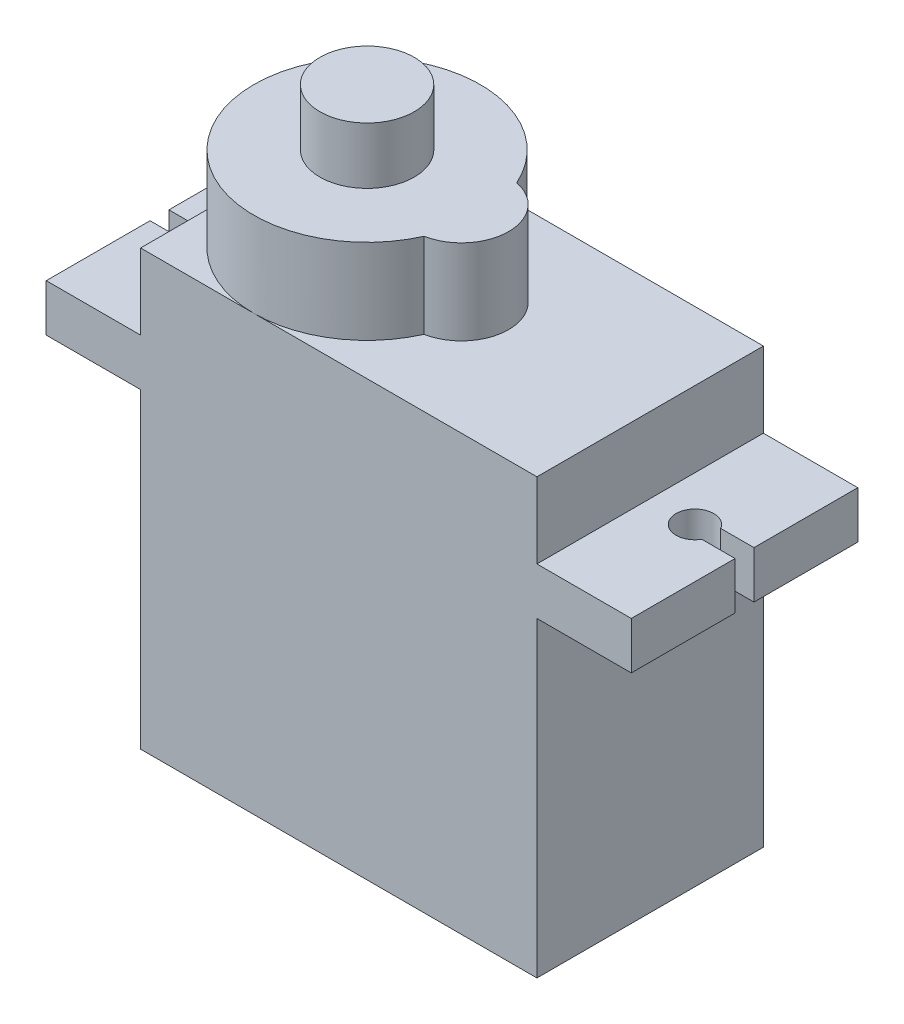
ISO-10303-21;
HEADER;
FILE_DESCRIPTION(('STEP AP214'),'2;1');
FILE_NAME('part.step','',(''),(''),'','','');
FILE_SCHEMA(('AUTOMOTIVE_DESIGN { 1 0 10303 214 1 1 1 1 }'));
ENDSEC;
DATA;
#1=APPLICATION_CONTEXT('core data for automotive mechanical design processes');
#2=APPLICATION_PROTOCOL_DEFINITION('international standard','automotive_design',2000,#1);
#3=PRODUCT_CONTEXT('',#1,'mechanical');
#4=PRODUCT('Part','Part','',(#3));
#5=PRODUCT_RELATED_PRODUCT_CATEGORY('part','',(#4));
#6=PRODUCT_DEFINITION_FORMATION('','',#4);
#7=PRODUCT_DEFINITION_CONTEXT('part definition',#1,'design');
#8=PRODUCT_DEFINITION('design','',#6,#7);
#9=PRODUCT_DEFINITION_SHAPE('','',#8);
#10=(LENGTH_UNIT() NAMED_UNIT(*) SI_UNIT(.MILLI.,.METRE.));
#11=(NAMED_UNIT(*) PLANE_ANGLE_UNIT() SI_UNIT($,.RADIAN.));
#12=(NAMED_UNIT(*) SI_UNIT($,.STERADIAN.) SOLID_ANGLE_UNIT());
#13=UNCERTAINTY_MEASURE_WITH_UNIT(LENGTH_MEASURE(1.E-05),#10,'distance_accuracy_value','');
#14=(GEOMETRIC_REPRESENTATION_CONTEXT(3) GLOBAL_UNCERTAINTY_ASSIGNED_CONTEXT((#13)) GLOBAL_UNIT_ASSIGNED_CONTEXT((#10,
#11,#12)) REPRESENTATION_CONTEXT('',''));
#15=CARTESIAN_POINT('',(0.,0.,0.));
#16=DIRECTION('',(0.,0.,1.));
#17=DIRECTION('',(1.,0.,0.));
#18=AXIS2_PLACEMENT_3D('',#15,#16,#17);
#19=CARTESIAN_POINT('',(0.,23.,0.));
#20=DIRECTION('',(0.,-1.,0.));
#21=DIRECTION('',(0.,0.,-1.));
#22=AXIS2_PLACEMENT_3D('',#19,#20,#21);
#23=PLANE('',#22);
#24=CARTESIAN_POINT('',(0.5,23.,0.));
#25=DIRECTION('',(0.,1.,0.));
#26=DIRECTION('',(0.,0.,1.));
#27=AXIS2_PLACEMENT_3D('',#24,#25,#26);
#28=CIRCLE('',#27,2.5);
#29=CARTESIAN_POINT('',(0.975000000000003,23.,2.45446022579303));
#30=VERTEX_POINT('',#29);
#31=CARTESIAN_POINT('',(0.975000000000002,23.,-2.45446022579303));
#32=VERTEX_POINT('',#31);
#33=EDGE_CURVE('E222',#30,#32,#28,.T.);
#34=ORIENTED_EDGE('',*,*,#33,.F.);
#35=CARTESIAN_POINT('',(-4.5,23.,0.));
#36=DIRECTION('',(0.,1.,0.));
#37=DIRECTION('',(0.,0.,1.));
#38=AXIS2_PLACEMENT_3D('',#35,#36,#37);
#39=CIRCLE('',#38,6.);
#40=CARTESIAN_POINT('',(-4.5,23.,6.));
#41=VERTEX_POINT('',#40);
#42=EDGE_CURVE('E70',#41,#30,#39,.T.);
#43=ORIENTED_EDGE('',*,*,#42,.F.);
#44=DIRECTION('',(1.,0.,0.));
#45=VECTOR('',#44,1.);
#46=CARTESIAN_POINT('',(-10.5,23.,6.));
#47=LINE('',#46,#45);
#48=CARTESIAN_POINT('',(10.5,23.,6.));
#49=VERTEX_POINT('',#48);
#50=EDGE_CURVE('E339',#41,#49,#47,.T.);
#51=ORIENTED_EDGE('',*,*,#50,.T.);
#52=DIRECTION('',(0.,0.,-1.));
#53=VECTOR('',#52,1.);
#54=CARTESIAN_POINT('',(10.5,23.,6.));
#55=LINE('',#54,#53);
#56=CARTESIAN_POINT('',(10.5,23.,-6.));
#57=VERTEX_POINT('',#56);
#58=EDGE_CURVE('E328',#49,#57,#55,.T.);
#59=ORIENTED_EDGE('',*,*,#58,.T.);
#60=DIRECTION('',(-1.,0.,0.));
#61=VECTOR('',#60,1.);
#62=CARTESIAN_POINT('',(-10.5,23.,-6.));
#63=LINE('',#62,#61);
#64=CARTESIAN_POINT('',(-4.5,23.,-6.));
#65=VERTEX_POINT('',#64);
#66=EDGE_CURVE('E333',#57,#65,#63,.T.);
#67=ORIENTED_EDGE('',*,*,#66,.T.);
#68=EDGE_CURVE('E64',#32,#65,#39,.T.);
#69=ORIENTED_EDGE('',*,*,#68,.F.);
#70=EDGE_LOOP('',(#34,#43,#51,#59,#67,#69));
#71=FACE_BOUND('',#70,.T.);
#72=ADVANCED_FACE('F47',(#71),#23,.F.);
#73=CARTESIAN_POINT('',(-10.5,23.,0.));
#74=VERTEX_POINT('',#73);
#75=EDGE_CURVE('E56',#65,#74,#39,.T.);
#76=ORIENTED_EDGE('',*,*,#75,.F.);
#77=CARTESIAN_POINT('',(-10.5,23.,-6.));
#78=VERTEX_POINT('',#77);
#79=EDGE_CURVE('E331',#65,#78,#63,.T.);
#80=ORIENTED_EDGE('',*,*,#79,.T.);
#81=DIRECTION('',(0.,0.,1.));
#82=VECTOR('',#81,1.);
#83=CARTESIAN_POINT('',(-10.5,23.,6.));
#84=LINE('',#83,#82);
#85=EDGE_CURVE('E336',#78,#74,#84,.T.);
#86=ORIENTED_EDGE('',*,*,#85,.T.);
#87=EDGE_LOOP('',(#76,#80,#86));
#88=FACE_BOUND('',#87,.T.);
#89=ADVANCED_FACE('F388',(#88),#23,.F.);
#90=CARTESIAN_POINT('',(-10.5,16.5,-11.5901699437495));
#91=DIRECTION('',(0.,-1.,0.));
#92=DIRECTION('',(1.,0.,0.));
#93=AXIS2_PLACEMENT_3D('',#90,#91,#92);
#94=PLANE('',#93);
#95=DIRECTION('',(0.,0.,1.));
#96=VECTOR('',#95,1.);
#97=CARTESIAN_POINT('',(-15.5,16.5,-11.5901699437495));
#98=LINE('',#97,#96);
#99=CARTESIAN_POINT('',(-15.5,16.5,0.5));
#100=VERTEX_POINT('',#99);
#101=CARTESIAN_POINT('',(-15.5,16.5,6.));
#102=VERTEX_POINT('',#101);
#103=EDGE_CURVE('E312',#100,#102,#98,.T.);
#104=ORIENTED_EDGE('',*,*,#103,.F.);
#105=DIRECTION('',(1.,0.,0.));
#106=VECTOR('',#105,1.);
#107=CARTESIAN_POINT('',(-10.5,16.5,0.5));
#108=LINE('',#107,#106);
#109=CARTESIAN_POINT('',(-13.7373598715682,16.5,0.5));
#110=VERTEX_POINT('',#109);
#111=EDGE_CURVE('E301',#100,#110,#108,.T.);
#112=ORIENTED_EDGE('',*,*,#111,.T.);
#113=CARTESIAN_POINT('',(-12.8713344677838,16.5,0.));
#114=DIRECTION('',(0.,-1.,0.));
#115=DIRECTION('',(1.,0.,0.));
#116=AXIS2_PLACEMENT_3D('',#113,#114,#115);
#117=CIRCLE('',#116,1.);
#118=CARTESIAN_POINT('',(-13.7373598715682,16.5,-0.5));
#119=VERTEX_POINT('',#118);
#120=EDGE_CURVE('E256',#119,#110,#117,.T.);
#121=ORIENTED_EDGE('',*,*,#120,.F.);
#122=DIRECTION('',(-1.,0.,0.));
#123=VECTOR('',#122,1.);
#124=CARTESIAN_POINT('',(-10.5,16.5,-0.5));
#125=LINE('',#124,#123);
#126=CARTESIAN_POINT('',(-15.5,16.5,-0.5));
#127=VERTEX_POINT('',#126);
#128=EDGE_CURVE('E915',#119,#127,#125,.T.);
#129=ORIENTED_EDGE('',*,*,#128,.T.);
#130=CARTESIAN_POINT('',(-15.5,16.5,-6.));
#131=VERTEX_POINT('',#130);
#132=EDGE_CURVE('E309',#131,#127,#98,.T.);
#133=ORIENTED_EDGE('',*,*,#132,.F.);
#134=DIRECTION('',(-1.,0.,0.));
#135=VECTOR('',#134,1.);
#136=CARTESIAN_POINT('',(-10.5,16.5,-6.));
#137=LINE('',#136,#135);
#138=CARTESIAN_POINT('',(-10.5,16.5,-6.));
#139=VERTEX_POINT('',#138);
#140=EDGE_CURVE('E300',#139,#131,#137,.T.);
#141=ORIENTED_EDGE('',*,*,#140,.F.);
#142=DIRECTION('',(0.,0.,1.));
#143=VECTOR('',#142,1.);
#144=CARTESIAN_POINT('',(-10.5,16.5,-11.5901699437495));
#145=LINE('',#144,#143);
#146=CARTESIAN_POINT('',(-10.5,16.5,6.));
#147=VERTEX_POINT('',#146);
#148=EDGE_CURVE('E313',#139,#147,#145,.T.);
#149=ORIENTED_EDGE('',*,*,#148,.T.);
#150=DIRECTION('',(1.,0.,0.));
#151=VECTOR('',#150,1.);
#152=CARTESIAN_POINT('',(-10.5,16.5,6.));
#153=LINE('',#152,#151);
#154=EDGE_CURVE('E304',#102,#147,#153,.T.);
#155=ORIENTED_EDGE('',*,*,#154,.F.);
#156=EDGE_LOOP('',(#104,#112,#121,#129,#133,#141,#149,#155));
#157=FACE_BOUND('',#156,.T.);
#158=ADVANCED_FACE('F449',(#157),#94,.T.);
#159=CARTESIAN_POINT('',(-15.5,19.,-11.5901699437495));
#160=DIRECTION('',(-1.,0.,0.));
#161=DIRECTION('',(0.,0.,1.));
#162=AXIS2_PLACEMENT_3D('',#159,#160,#161);
#163=PLANE('',#162);
#164=DIRECTION('',(0.,0.,1.));
#165=VECTOR('',#164,1.);
#166=CARTESIAN_POINT('',(-15.5,19.,-11.5901699437495));
#167=LINE('',#166,#165);
#168=CARTESIAN_POINT('',(-15.5,19.,0.5));
#169=VERTEX_POINT('',#168);
#170=CARTESIAN_POINT('',(-15.5,19.,6.));
#171=VERTEX_POINT('',#170);
#172=EDGE_CURVE('E308',#169,#171,#167,.T.);
#173=ORIENTED_EDGE('',*,*,#172,.F.);
#174=DIRECTION('',(0.,-1.,0.));
#175=VECTOR('',#174,1.);
#176=CARTESIAN_POINT('',(-15.5,23.000012,0.5));
#177=LINE('',#176,#175);
#178=EDGE_CURVE('E223',#169,#100,#177,.T.);
#179=ORIENTED_EDGE('',*,*,#178,.T.);
#180=ORIENTED_EDGE('',*,*,#103,.T.);
#181=DIRECTION('',(0.,-1.,0.));
#182=VECTOR('',#181,1.);
#183=CARTESIAN_POINT('',(-15.5,19.,6.));
#184=LINE('',#183,#182);
#185=EDGE_CURVE('E319',#171,#102,#184,.T.);
#186=ORIENTED_EDGE('',*,*,#185,.F.);
#187=EDGE_LOOP('',(#173,#179,#180,#186));
#188=FACE_BOUND('',#187,.T.);
#189=ADVANCED_FACE('F468',(#188),#163,.T.);
#190=ORIENTED_EDGE('',*,*,#132,.T.);
#191=DIRECTION('',(0.,-1.,0.));
#192=VECTOR('',#191,1.);
#193=CARTESIAN_POINT('',(-15.5,23.000012,-0.5));
#194=LINE('',#193,#192);
#195=CARTESIAN_POINT('',(-15.5,19.,-0.5));
#196=VERTEX_POINT('',#195);
#197=EDGE_CURVE('E226',#196,#127,#194,.T.);
#198=ORIENTED_EDGE('',*,*,#197,.F.);
#199=CARTESIAN_POINT('',(-15.5,19.,-6.));
#200=VERTEX_POINT('',#199);
#201=EDGE_CURVE('E305',#200,#196,#167,.T.);
#202=ORIENTED_EDGE('',*,*,#201,.F.);
#203=DIRECTION('',(0.,1.,0.));
#204=VECTOR('',#203,1.);
#205=CARTESIAN_POINT('',(-15.5,19.,-6.));
#206=LINE('',#205,#204);
#207=EDGE_CURVE('E316',#131,#200,#206,.T.);
#208=ORIENTED_EDGE('',*,*,#207,.F.);
#209=EDGE_LOOP('',(#190,#198,#202,#208));
#210=FACE_BOUND('',#209,.T.);
#211=ADVANCED_FACE('F504',(#210),#163,.T.);
#212=CARTESIAN_POINT('',(-10.5,19.,-11.5901699437495));
#213=DIRECTION('',(0.,1.,0.));
#214=DIRECTION('',(-1.,0.,0.));
#215=AXIS2_PLACEMENT_3D('',#212,#213,#214);
#216=PLANE('',#215);
#217=CARTESIAN_POINT('',(-12.8713344677838,19.,0.));
#218=DIRECTION('',(0.,1.,0.));
#219=DIRECTION('',(-1.,0.,0.));
#220=AXIS2_PLACEMENT_3D('',#217,#218,#219);
#221=CIRCLE('',#220,1.);
#222=CARTESIAN_POINT('',(-13.7373598715682,19.,0.5));
#223=VERTEX_POINT('',#222);
#224=CARTESIAN_POINT('',(-13.7373598715682,19.,-0.5));
#225=VERTEX_POINT('',#224);
#226=EDGE_CURVE('E373',#223,#225,#221,.T.);
#227=ORIENTED_EDGE('',*,*,#226,.F.);
#228=DIRECTION('',(-1.,0.,0.));
#229=VECTOR('',#228,1.);
#230=CARTESIAN_POINT('',(-10.5,19.,0.5));
#231=LINE('',#230,#229);
#232=EDGE_CURVE('E51',#223,#169,#231,.T.);
#233=ORIENTED_EDGE('',*,*,#232,.T.);
#234=ORIENTED_EDGE('',*,*,#172,.T.);
#235=DIRECTION('',(-1.,0.,0.));
#236=VECTOR('',#235,1.);
#237=CARTESIAN_POINT('',(-10.5,19.,6.));
#238=LINE('',#237,#236);
#239=CARTESIAN_POINT('',(-10.5,19.,6.));
#240=VERTEX_POINT('',#239);
#241=EDGE_CURVE('E322',#240,#171,#238,.T.);
#242=ORIENTED_EDGE('',*,*,#241,.F.);
#243=DIRECTION('',(0.,0.,1.));
#244=VECTOR('',#243,1.);
#245=CARTESIAN_POINT('',(-10.5,19.,-11.5901699437495));
#246=LINE('',#245,#244);
#247=CARTESIAN_POINT('',(-10.5,19.,-6.));
#248=VERTEX_POINT('',#247);
#249=EDGE_CURVE('E302',#248,#240,#246,.T.);
#250=ORIENTED_EDGE('',*,*,#249,.F.);
#251=DIRECTION('',(1.,0.,0.));
#252=VECTOR('',#251,1.);
#253=CARTESIAN_POINT('',(-10.5,19.,-6.));
#254=LINE('',#253,#252);
#255=EDGE_CURVE('E297',#200,#248,#254,.T.);
#256=ORIENTED_EDGE('',*,*,#255,.F.);
#257=ORIENTED_EDGE('',*,*,#201,.T.);
#258=DIRECTION('',(1.,0.,0.));
#259=VECTOR('',#258,1.);
#260=CARTESIAN_POINT('',(-10.5,19.,-0.5));
#261=LINE('',#260,#259);
#262=EDGE_CURVE('E374',#196,#225,#261,.T.);
#263=ORIENTED_EDGE('',*,*,#262,.T.);
#264=EDGE_LOOP('',(#227,#233,#234,#242,#250,#256,#257,#263));
#265=FACE_BOUND('',#264,.T.);
#266=ADVANCED_FACE('F464',(#265),#216,.T.);
#267=CARTESIAN_POINT('',(10.5,19.,-11.5901699437495));
#268=DIRECTION('',(0.,1.,0.));
#269=DIRECTION('',(0.,0.,1.));
#270=AXIS2_PLACEMENT_3D('',#267,#268,#269);
#271=PLANE('',#270);
#272=CARTESIAN_POINT('',(12.8713344677838,19.,0.));
#273=DIRECTION('',(0.,1.,0.));
#274=DIRECTION('',(0.,0.,1.));
#275=AXIS2_PLACEMENT_3D('',#272,#273,#274);
#276=CIRCLE('',#275,1.);
#277=CARTESIAN_POINT('',(13.7373598715682,19.,-0.499999999999984));
#278=VERTEX_POINT('',#277);
#279=CARTESIAN_POINT('',(13.7373598715682,19.,0.500000000000016));
#280=VERTEX_POINT('',#279);
#281=EDGE_CURVE('E247',#278,#280,#276,.T.);
#282=ORIENTED_EDGE('',*,*,#281,.F.);
#283=DIRECTION('',(1.,0.,0.));
#284=VECTOR('',#283,1.);
#285=CARTESIAN_POINT('',(10.5,19.,-0.499999999999988));
#286=LINE('',#285,#284);
#287=CARTESIAN_POINT('',(15.5,19.,-0.499999999999983));
#288=VERTEX_POINT('',#287);
#289=EDGE_CURVE('E253',#278,#288,#286,.T.);
#290=ORIENTED_EDGE('',*,*,#289,.T.);
#291=DIRECTION('',(0.,0.,1.));
#292=VECTOR('',#291,1.);
#293=CARTESIAN_POINT('',(15.5,19.,-11.5901699437495));
#294=LINE('',#293,#292);
#295=CARTESIAN_POINT('',(15.5,19.,-6.));
#296=VERTEX_POINT('',#295);
#297=EDGE_CURVE('E275',#296,#288,#294,.T.);
#298=ORIENTED_EDGE('',*,*,#297,.F.);
#299=DIRECTION('',(1.,0.,0.));
#300=VECTOR('',#299,1.);
#301=CARTESIAN_POINT('',(10.5,19.,-6.));
#302=LINE('',#301,#300);
#303=CARTESIAN_POINT('',(10.5,19.,-6.));
#304=VERTEX_POINT('',#303);
#305=EDGE_CURVE('E296',#304,#296,#302,.T.);
#306=ORIENTED_EDGE('',*,*,#305,.F.);
#307=DIRECTION('',(0.,0.,1.));
#308=VECTOR('',#307,1.);
#309=CARTESIAN_POINT('',(10.5,19.,-11.5901699437495));
#310=LINE('',#309,#308);
#311=CARTESIAN_POINT('',(10.5,19.,6.));
#312=VERTEX_POINT('',#311);
#313=EDGE_CURVE('E399',#304,#312,#310,.T.);
#314=ORIENTED_EDGE('',*,*,#313,.T.);
#315=DIRECTION('',(-1.,0.,0.));
#316=VECTOR('',#315,1.);
#317=CARTESIAN_POINT('',(10.5,19.,6.));
#318=LINE('',#317,#316);
#319=CARTESIAN_POINT('',(15.5,19.,6.));
#320=VERTEX_POINT('',#319);
#321=EDGE_CURVE('E293',#320,#312,#318,.T.);
#322=ORIENTED_EDGE('',*,*,#321,.F.);
#323=CARTESIAN_POINT('',(15.5,19.,0.500000000000017));
#324=VERTEX_POINT('',#323);
#325=EDGE_CURVE('E285',#324,#320,#294,.T.);
#326=ORIENTED_EDGE('',*,*,#325,.F.);
#327=DIRECTION('',(-1.,0.,0.));
#328=VECTOR('',#327,1.);
#329=CARTESIAN_POINT('',(10.5,19.,0.500000000000013));
#330=LINE('',#329,#328);
#331=EDGE_CURVE('E249',#324,#280,#330,.T.);
#332=ORIENTED_EDGE('',*,*,#331,.T.);
#333=EDGE_LOOP('',(#282,#290,#298,#306,#314,#322,#326,#332));
#334=FACE_BOUND('',#333,.T.);
#335=ADVANCED_FACE('F403',(#334),#271,.T.);
#336=CARTESIAN_POINT('',(15.5,19.,-11.5901699437495));
#337=DIRECTION('',(1.,0.,0.));
#338=DIRECTION('',(0.,1.,0.));
#339=AXIS2_PLACEMENT_3D('',#336,#337,#338);
#340=PLANE('',#339);
#341=ORIENTED_EDGE('',*,*,#297,.T.);
#342=DIRECTION('',(0.,-1.,0.));
#343=VECTOR('',#342,1.);
#344=CARTESIAN_POINT('',(15.5,23.000012,-0.499999999999983));
#345=LINE('',#344,#343);
#346=CARTESIAN_POINT('',(15.5,16.5,-0.499999999999983));
#347=VERTEX_POINT('',#346);
#348=EDGE_CURVE('E246',#288,#347,#345,.T.);
#349=ORIENTED_EDGE('',*,*,#348,.T.);
#350=DIRECTION('',(0.,0.,1.));
#351=VECTOR('',#350,1.);
#352=CARTESIAN_POINT('',(15.5,16.5,-11.5901699437495));
#353=LINE('',#352,#351);
#354=CARTESIAN_POINT('',(15.5,16.5,-6.));
#355=VERTEX_POINT('',#354);
#356=EDGE_CURVE('E272',#355,#347,#353,.T.);
#357=ORIENTED_EDGE('',*,*,#356,.F.);
#358=DIRECTION('',(0.,-1.,0.));
#359=VECTOR('',#358,1.);
#360=CARTESIAN_POINT('',(15.5,19.,-6.));
#361=LINE('',#360,#359);
#362=EDGE_CURVE('E406',#296,#355,#361,.T.);
#363=ORIENTED_EDGE('',*,*,#362,.F.);
#364=EDGE_LOOP('',(#341,#349,#357,#363));
#365=FACE_BOUND('',#364,.T.);
#366=ADVANCED_FACE('F270',(#365),#340,.T.);
#367=CARTESIAN_POINT('',(15.5,16.5,0.500000000000017));
#368=VERTEX_POINT('',#367);
#369=CARTESIAN_POINT('',(15.5,16.5,6.));
#370=VERTEX_POINT('',#369);
#371=EDGE_CURVE('E286',#368,#370,#353,.T.);
#372=ORIENTED_EDGE('',*,*,#371,.F.);
#373=DIRECTION('',(0.,-1.,0.));
#374=VECTOR('',#373,1.);
#375=CARTESIAN_POINT('',(15.5,23.000012,0.500000000000017));
#376=LINE('',#375,#374);
#377=EDGE_CURVE('E250',#324,#368,#376,.T.);
#378=ORIENTED_EDGE('',*,*,#377,.F.);
#379=ORIENTED_EDGE('',*,*,#325,.T.);
#380=DIRECTION('',(0.,1.,0.));
#381=VECTOR('',#380,1.);
#382=CARTESIAN_POINT('',(15.5,19.,6.));
#383=LINE('',#382,#381);
#384=EDGE_CURVE('E413',#370,#320,#383,.T.);
#385=ORIENTED_EDGE('',*,*,#384,.F.);
#386=EDGE_LOOP('',(#372,#378,#379,#385));
#387=FACE_BOUND('',#386,.T.);
#388=ADVANCED_FACE('F423',(#387),#340,.T.);
#389=CARTESIAN_POINT('',(10.5,16.5,-11.5901699437495));
#390=DIRECTION('',(0.,-1.,0.));
#391=DIRECTION('',(0.,0.,-1.));
#392=AXIS2_PLACEMENT_3D('',#389,#390,#391);
#393=PLANE('',#392);
#394=ORIENTED_EDGE('',*,*,#356,.T.);
#395=DIRECTION('',(-1.,0.,0.));
#396=VECTOR('',#395,1.);
#397=CARTESIAN_POINT('',(10.5,16.5,-0.499999999999988));
#398=LINE('',#397,#396);
#399=CARTESIAN_POINT('',(13.7373598715682,16.5,-0.499999999999984));
#400=VERTEX_POINT('',#399);
#401=EDGE_CURVE('E281',#347,#400,#398,.T.);
#402=ORIENTED_EDGE('',*,*,#401,.T.);
#403=CARTESIAN_POINT('',(12.8713344677838,16.5,0.));
#404=DIRECTION('',(0.,-1.,0.));
#405=DIRECTION('',(0.,0.,-1.));
#406=AXIS2_PLACEMENT_3D('',#403,#404,#405);
#407=CIRCLE('',#406,1.);
#408=CARTESIAN_POINT('',(13.7373598715682,16.5,0.500000000000016));
#409=VERTEX_POINT('',#408);
#410=EDGE_CURVE('E367',#409,#400,#407,.T.);
#411=ORIENTED_EDGE('',*,*,#410,.F.);
#412=DIRECTION('',(1.,0.,0.));
#413=VECTOR('',#412,1.);
#414=CARTESIAN_POINT('',(10.5,16.5,0.500000000000013));
#415=LINE('',#414,#413);
#416=EDGE_CURVE('E369',#409,#368,#415,.T.);
#417=ORIENTED_EDGE('',*,*,#416,.T.);
#418=ORIENTED_EDGE('',*,*,#371,.T.);
#419=DIRECTION('',(1.,0.,0.));
#420=VECTOR('',#419,1.);
#421=CARTESIAN_POINT('',(10.5,16.5,6.));
#422=LINE('',#421,#420);
#423=CARTESIAN_POINT('',(10.5,16.5,6.));
#424=VERTEX_POINT('',#423);
#425=EDGE_CURVE('E325',#424,#370,#422,.T.);
#426=ORIENTED_EDGE('',*,*,#425,.F.);
#427=DIRECTION('',(0.,0.,1.));
#428=VECTOR('',#427,1.);
#429=CARTESIAN_POINT('',(10.5,16.5,-11.5901699437495));
#430=LINE('',#429,#428);
#431=CARTESIAN_POINT('',(10.5,16.5,-6.));
#432=VERTEX_POINT('',#431);
#433=EDGE_CURVE('E289',#432,#424,#430,.T.);
#434=ORIENTED_EDGE('',*,*,#433,.F.);
#435=DIRECTION('',(-1.,0.,0.));
#436=VECTOR('',#435,1.);
#437=CARTESIAN_POINT('',(10.5,16.5,-6.));
#438=LINE('',#437,#436);
#439=EDGE_CURVE('E284',#355,#432,#438,.T.);
#440=ORIENTED_EDGE('',*,*,#439,.F.);
#441=EDGE_LOOP('',(#394,#402,#411,#417,#418,#426,#434,#440));
#442=FACE_BOUND('',#441,.T.);
#443=ADVANCED_FACE('F279',(#442),#393,.T.);
#444=CARTESIAN_POINT('',(10.5,23.,6.));
#445=DIRECTION('',(-1.,0.,0.));
#446=DIRECTION('',(0.,0.,1.));
#447=AXIS2_PLACEMENT_3D('',#444,#445,#446);
#448=PLANE('',#447);
#449=ORIENTED_EDGE('',*,*,#313,.F.);
#450=DIRECTION('',(0.,-1.,0.));
#451=VECTOR('',#450,1.);
#452=CARTESIAN_POINT('',(10.5,23.,-6.));
#453=LINE('',#452,#451);
#454=EDGE_CURVE('E364',#57,#304,#453,.T.);
#455=ORIENTED_EDGE('',*,*,#454,.F.);
#456=ORIENTED_EDGE('',*,*,#58,.F.);
#457=DIRECTION('',(0.,-1.,0.));
#458=VECTOR('',#457,1.);
#459=CARTESIAN_POINT('',(10.5,23.,6.));
#460=LINE('',#459,#458);
#461=EDGE_CURVE('E354',#49,#312,#460,.T.);
#462=ORIENTED_EDGE('',*,*,#461,.T.);
#463=EDGE_LOOP('',(#449,#455,#456,#462));
#464=FACE_BOUND('',#463,.T.);
#465=ADVANCED_FACE('F397',(#464),#448,.F.);
#466=CARTESIAN_POINT('',(-10.5,23.,6.));
#467=DIRECTION('',(1.,0.,0.));
#468=DIRECTION('',(0.,0.,-1.));
#469=AXIS2_PLACEMENT_3D('',#466,#467,#468);
#470=PLANE('',#469);
#471=ORIENTED_EDGE('',*,*,#148,.F.);
#472=DIRECTION('',(0.,-1.,0.));
#473=VECTOR('',#472,1.);
#474=CARTESIAN_POINT('',(-10.5,23.,-6.));
#475=LINE('',#474,#473);
#476=CARTESIAN_POINT('',(-10.5,0.,-6.));
#477=VERTEX_POINT('',#476);
#478=EDGE_CURVE('E360',#139,#477,#475,.T.);
#479=ORIENTED_EDGE('',*,*,#478,.T.);
#480=DIRECTION('',(0.,0.,1.));
#481=VECTOR('',#480,1.);
#482=CARTESIAN_POINT('',(-10.5,0.,6.));
#483=LINE('',#482,#481);
#484=CARTESIAN_POINT('',(-10.5,0.,6.));
#485=VERTEX_POINT('',#484);
#486=EDGE_CURVE('E349',#477,#485,#483,.T.);
#487=ORIENTED_EDGE('',*,*,#486,.T.);
#488=DIRECTION('',(0.,-1.,0.));
#489=VECTOR('',#488,1.);
#490=CARTESIAN_POINT('',(-10.5,23.,6.));
#491=LINE('',#490,#489);
#492=EDGE_CURVE('E356',#147,#485,#491,.T.);
#493=ORIENTED_EDGE('',*,*,#492,.F.);
#494=EDGE_LOOP('',(#471,#479,#487,#493));
#495=FACE_BOUND('',#494,.T.);
#496=ADVANCED_FACE('F477',(#495),#470,.F.);
#497=CARTESIAN_POINT('',(10.5,0.,-6.));
#498=VERTEX_POINT('',#497);
#499=EDGE_CURVE('E363',#432,#498,#453,.T.);
#500=ORIENTED_EDGE('',*,*,#499,.F.);
#501=ORIENTED_EDGE('',*,*,#433,.T.);
#502=CARTESIAN_POINT('',(10.5,0.,6.));
#503=VERTEX_POINT('',#502);
#504=EDGE_CURVE('E343',#424,#503,#460,.T.);
#505=ORIENTED_EDGE('',*,*,#504,.T.);
#506=DIRECTION('',(0.,0.,-1.));
#507=VECTOR('',#506,1.);
#508=CARTESIAN_POINT('',(10.5,0.,6.));
#509=LINE('',#508,#507);
#510=EDGE_CURVE('E295',#503,#498,#509,.T.);
#511=ORIENTED_EDGE('',*,*,#510,.T.);
#512=EDGE_LOOP('',(#500,#501,#505,#511));
#513=FACE_BOUND('',#512,.T.);
#514=ADVANCED_FACE('F49',(#513),#448,.F.);
#515=CARTESIAN_POINT('',(-10.5,23.,-6.));
#516=DIRECTION('',(0.,0.,1.));
#517=DIRECTION('',(1.,0.,0.));
#518=AXIS2_PLACEMENT_3D('',#515,#516,#517);
#519=PLANE('',#518);
#520=DIRECTION('',(-1.,0.,0.));
#521=VECTOR('',#520,1.);
#522=CARTESIAN_POINT('',(-10.5,0.,-6.));
#523=LINE('',#522,#521);
#524=EDGE_CURVE('E346',#498,#477,#523,.T.);
#525=ORIENTED_EDGE('',*,*,#524,.T.);
#526=ORIENTED_EDGE('',*,*,#478,.F.);
#527=ORIENTED_EDGE('',*,*,#140,.T.);
#528=ORIENTED_EDGE('',*,*,#207,.T.);
#529=ORIENTED_EDGE('',*,*,#255,.T.);
#530=EDGE_CURVE('E361',#78,#248,#475,.T.);
#531=ORIENTED_EDGE('',*,*,#530,.F.);
#532=ORIENTED_EDGE('',*,*,#79,.F.);
#533=ORIENTED_EDGE('',*,*,#66,.F.);
#534=ORIENTED_EDGE('',*,*,#454,.T.);
#535=ORIENTED_EDGE('',*,*,#305,.T.);
#536=ORIENTED_EDGE('',*,*,#362,.T.);
#537=ORIENTED_EDGE('',*,*,#439,.T.);
#538=ORIENTED_EDGE('',*,*,#499,.T.);
#539=EDGE_LOOP('',(#525,#526,#527,#528,#529,#531,#532,#533,#534,#535,#536,#537,#538));
#540=FACE_BOUND('',#539,.T.);
#541=ADVANCED_FACE('F392',(#540),#519,.F.);
#542=ORIENTED_EDGE('',*,*,#530,.T.);
#543=ORIENTED_EDGE('',*,*,#249,.T.);
#544=CARTESIAN_POINT('',(-10.5,23.,6.));
#545=VERTEX_POINT('',#544);
#546=EDGE_CURVE('E357',#545,#240,#491,.T.);
#547=ORIENTED_EDGE('',*,*,#546,.F.);
#548=EDGE_CURVE('E335',#74,#545,#84,.T.);
#549=ORIENTED_EDGE('',*,*,#548,.F.);
#550=ORIENTED_EDGE('',*,*,#85,.F.);
#551=EDGE_LOOP('',(#542,#543,#547,#549,#550));
#552=FACE_BOUND('',#551,.T.);
#553=ADVANCED_FACE('F456',(#552),#470,.F.);
#554=CARTESIAN_POINT('',(-10.5,23.,6.));
#555=DIRECTION('',(0.,0.,-1.));
#556=DIRECTION('',(-1.,0.,0.));
#557=AXIS2_PLACEMENT_3D('',#554,#555,#556);
#558=PLANE('',#557);
#559=DIRECTION('',(1.,0.,0.));
#560=VECTOR('',#559,1.);
#561=CARTESIAN_POINT('',(-10.5,0.,6.));
#562=LINE('',#561,#560);
#563=EDGE_CURVE('E332',#485,#503,#562,.T.);
#564=ORIENTED_EDGE('',*,*,#563,.T.);
#565=ORIENTED_EDGE('',*,*,#504,.F.);
#566=ORIENTED_EDGE('',*,*,#425,.T.);
#567=ORIENTED_EDGE('',*,*,#384,.T.);
#568=ORIENTED_EDGE('',*,*,#321,.T.);
#569=ORIENTED_EDGE('',*,*,#461,.F.);
#570=ORIENTED_EDGE('',*,*,#50,.F.);
#571=EDGE_CURVE('E340',#545,#41,#47,.T.);
#572=ORIENTED_EDGE('',*,*,#571,.F.);
#573=ORIENTED_EDGE('',*,*,#546,.T.);
#574=ORIENTED_EDGE('',*,*,#241,.T.);
#575=ORIENTED_EDGE('',*,*,#185,.T.);
#576=ORIENTED_EDGE('',*,*,#154,.T.);
#577=ORIENTED_EDGE('',*,*,#492,.T.);
#578=EDGE_LOOP('',(#564,#565,#566,#567,#568,#569,#570,#572,#573,#574,#575,#576,#577));
#579=FACE_BOUND('',#578,.T.);
#580=ADVANCED_FACE('F417',(#579),#558,.F.);
#581=EDGE_CURVE('E381',#74,#41,#39,.T.);
#582=ORIENTED_EDGE('',*,*,#581,.F.);
#583=ORIENTED_EDGE('',*,*,#548,.T.);
#584=ORIENTED_EDGE('',*,*,#571,.T.);
#585=EDGE_LOOP('',(#582,#583,#584));
#586=FACE_BOUND('',#585,.T.);
#587=ADVANCED_FACE('F440',(#586),#23,.F.);
#588=CARTESIAN_POINT('',(0.,0.,0.));
#589=DIRECTION('',(0.,-1.,0.));
#590=DIRECTION('',(0.,0.,-1.));
#591=AXIS2_PLACEMENT_3D('',#588,#589,#590);
#592=PLANE('',#591);
#593=ORIENTED_EDGE('',*,*,#510,.F.);
#594=ORIENTED_EDGE('',*,*,#563,.F.);
#595=ORIENTED_EDGE('',*,*,#486,.F.);
#596=ORIENTED_EDGE('',*,*,#524,.F.);
#597=EDGE_LOOP('',(#593,#594,#595,#596));
#598=FACE_BOUND('',#597,.T.);
#599=ADVANCED_FACE('F433',(#598),#592,.T.);
#600=CARTESIAN_POINT('',(15.5,23.000012,-0.499999999999983));
#601=DIRECTION('',(0.,0.,1.));
#602=DIRECTION('',(1.,0.,0.));
#603=AXIS2_PLACEMENT_3D('',#600,#601,#602);
#604=PLANE('',#603);
#605=DIRECTION('',(0.,1.,0.));
#606=VECTOR('',#605,1.);
#607=CARTESIAN_POINT('',(13.7373598715682,11.,-0.499999999999984));
#608=LINE('',#607,#606);
#609=EDGE_CURVE('E236',#400,#278,#608,.T.);
#610=ORIENTED_EDGE('',*,*,#609,.F.);
#611=ORIENTED_EDGE('',*,*,#401,.F.);
#612=ORIENTED_EDGE('',*,*,#348,.F.);
#613=ORIENTED_EDGE('',*,*,#289,.F.);
#614=EDGE_LOOP('',(#610,#611,#612,#613));
#615=FACE_BOUND('',#614,.T.);
#616=ADVANCED_FACE('F431',(#615),#604,.T.);
#617=CARTESIAN_POINT('',(15.5,23.000012,0.500000000000017));
#618=DIRECTION('',(0.,0.,-1.));
#619=DIRECTION('',(-1.,0.,0.));
#620=AXIS2_PLACEMENT_3D('',#617,#618,#619);
#621=PLANE('',#620);
#622=ORIENTED_EDGE('',*,*,#377,.T.);
#623=ORIENTED_EDGE('',*,*,#416,.F.);
#624=DIRECTION('',(0.,1.,0.));
#625=VECTOR('',#624,1.);
#626=CARTESIAN_POINT('',(13.7373598715682,11.,0.500000000000016));
#627=LINE('',#626,#625);
#628=EDGE_CURVE('E240',#409,#280,#627,.T.);
#629=ORIENTED_EDGE('',*,*,#628,.T.);
#630=ORIENTED_EDGE('',*,*,#331,.F.);
#631=EDGE_LOOP('',(#622,#623,#629,#630));
#632=FACE_BOUND('',#631,.T.);
#633=ADVANCED_FACE('F426',(#632),#621,.T.);
#634=CARTESIAN_POINT('',(12.8713344677838,11.,0.));
#635=DIRECTION('',(0.,1.,0.));
#636=DIRECTION('',(0.,0.,1.));
#637=AXIS2_PLACEMENT_3D('',#634,#635,#636);
#638=CYLINDRICAL_SURFACE('',#637,1.);
#639=ORIENTED_EDGE('',*,*,#281,.T.);
#640=ORIENTED_EDGE('',*,*,#628,.F.);
#641=ORIENTED_EDGE('',*,*,#410,.T.);
#642=ORIENTED_EDGE('',*,*,#609,.T.);
#643=EDGE_LOOP('',(#639,#640,#641,#642));
#644=FACE_BOUND('',#643,.T.);
#645=ADVANCED_FACE('F430',(#644),#638,.F.);
#646=CARTESIAN_POINT('',(-15.5,23.000012,0.5));
#647=DIRECTION('',(0.,0.,-1.));
#648=DIRECTION('',(-1.,0.,0.));
#649=AXIS2_PLACEMENT_3D('',#646,#647,#648);
#650=PLANE('',#649);
#651=ORIENTED_EDGE('',*,*,#178,.F.);
#652=ORIENTED_EDGE('',*,*,#232,.F.);
#653=DIRECTION('',(0.,1.,0.));
#654=VECTOR('',#653,1.);
#655=CARTESIAN_POINT('',(-13.7373598715682,11.,0.5));
#656=LINE('',#655,#654);
#657=EDGE_CURVE('E241',#110,#223,#656,.T.);
#658=ORIENTED_EDGE('',*,*,#657,.F.);
#659=ORIENTED_EDGE('',*,*,#111,.F.);
#660=EDGE_LOOP('',(#651,#652,#658,#659));
#661=FACE_BOUND('',#660,.T.);
#662=ADVANCED_FACE('F606',(#661),#650,.T.);
#663=CARTESIAN_POINT('',(-15.5,23.000012,-0.5));
#664=DIRECTION('',(0.,0.,1.));
#665=DIRECTION('',(1.,0.,0.));
#666=AXIS2_PLACEMENT_3D('',#663,#664,#665);
#667=PLANE('',#666);
#668=DIRECTION('',(0.,1.,0.));
#669=VECTOR('',#668,1.);
#670=CARTESIAN_POINT('',(-13.7373598715682,11.,-0.5));
#671=LINE('',#670,#669);
#672=EDGE_CURVE('E258',#119,#225,#671,.T.);
#673=ORIENTED_EDGE('',*,*,#672,.T.);
#674=ORIENTED_EDGE('',*,*,#262,.F.);
#675=ORIENTED_EDGE('',*,*,#197,.T.);
#676=ORIENTED_EDGE('',*,*,#128,.F.);
#677=EDGE_LOOP('',(#673,#674,#675,#676));
#678=FACE_BOUND('',#677,.T.);
#679=ADVANCED_FACE('F615',(#678),#667,.T.);
#680=CARTESIAN_POINT('',(-12.8713344677838,11.,0.));
#681=DIRECTION('',(0.,1.,0.));
#682=DIRECTION('',(0.,0.,1.));
#683=AXIS2_PLACEMENT_3D('',#680,#681,#682);
#684=CYLINDRICAL_SURFACE('',#683,1.);
#685=ORIENTED_EDGE('',*,*,#120,.T.);
#686=ORIENTED_EDGE('',*,*,#657,.T.);
#687=ORIENTED_EDGE('',*,*,#226,.T.);
#688=ORIENTED_EDGE('',*,*,#672,.F.);
#689=EDGE_LOOP('',(#685,#686,#687,#688));
#690=FACE_BOUND('',#689,.T.);
#691=ADVANCED_FACE('F624',(#690),#684,.F.);
#692=CARTESIAN_POINT('',(0.5,27.5,0.));
#693=DIRECTION('',(0.,-1.,0.));
#694=DIRECTION('',(0.,0.,-1.));
#695=AXIS2_PLACEMENT_3D('',#692,#693,#694);
#696=CYLINDRICAL_SURFACE('',#695,2.5);
#697=ORIENTED_EDGE('',*,*,#33,.T.);
#698=DIRECTION('',(0.,-1.,0.));
#699=VECTOR('',#698,1.);
#700=CARTESIAN_POINT('',(0.975000000000002,27.5,-2.45446022579303));
#701=LINE('',#700,#699);
#702=CARTESIAN_POINT('',(0.975000000000002,27.5,-2.45446022579303));
#703=VERTEX_POINT('',#702);
#704=EDGE_CURVE('E210',#703,#32,#701,.T.);
#705=ORIENTED_EDGE('',*,*,#704,.F.);
#706=CARTESIAN_POINT('',(0.5,27.5,0.));
#707=DIRECTION('',(0.,1.,0.));
#708=DIRECTION('',(0.,0.,1.));
#709=AXIS2_PLACEMENT_3D('',#706,#707,#708);
#710=CIRCLE('',#709,2.5);
#711=CARTESIAN_POINT('',(0.975000000000003,27.5,2.45446022579303));
#712=VERTEX_POINT('',#711);
#713=EDGE_CURVE('E216',#712,#703,#710,.T.);
#714=ORIENTED_EDGE('',*,*,#713,.F.);
#715=DIRECTION('',(0.,-1.,0.));
#716=VECTOR('',#715,1.);
#717=CARTESIAN_POINT('',(0.975000000000003,27.5,2.45446022579303));
#718=LINE('',#717,#716);
#719=EDGE_CURVE('E213',#712,#30,#718,.T.);
#720=ORIENTED_EDGE('',*,*,#719,.T.);
#721=EDGE_LOOP('',(#697,#705,#714,#720));
#722=FACE_BOUND('',#721,.T.);
#723=ADVANCED_FACE('F221',(#722),#696,.T.);
#724=CARTESIAN_POINT('',(-4.5,27.5,0.));
#725=DIRECTION('',(0.,-1.,0.));
#726=DIRECTION('',(0.,0.,-1.));
#727=AXIS2_PLACEMENT_3D('',#724,#725,#726);
#728=CYLINDRICAL_SURFACE('',#727,6.);
#729=ORIENTED_EDGE('',*,*,#68,.T.);
#730=ORIENTED_EDGE('',*,*,#75,.T.);
#731=ORIENTED_EDGE('',*,*,#581,.T.);
#732=ORIENTED_EDGE('',*,*,#42,.T.);
#733=ORIENTED_EDGE('',*,*,#719,.F.);
#734=CARTESIAN_POINT('',(-4.5,27.5,0.));
#735=DIRECTION('',(0.,1.,0.));
#736=DIRECTION('',(0.,0.,1.));
#737=AXIS2_PLACEMENT_3D('',#734,#735,#736);
#738=CIRCLE('',#737,6.);
#739=EDGE_CURVE('E206',#703,#712,#738,.T.);
#740=ORIENTED_EDGE('',*,*,#739,.F.);
#741=ORIENTED_EDGE('',*,*,#704,.T.);
#742=EDGE_LOOP('',(#729,#730,#731,#732,#733,#740,#741));
#743=FACE_BOUND('',#742,.T.);
#744=ADVANCED_FACE('F208',(#743),#728,.T.);
#745=CARTESIAN_POINT('',(-2.,27.5,0.));
#746=DIRECTION('',(0.,1.,0.));
#747=DIRECTION('',(0.,0.,1.));
#748=AXIS2_PLACEMENT_3D('',#745,#746,#747);
#749=PLANE('',#748);
#750=CARTESIAN_POINT('',(-4.5,27.5,0.));
#751=DIRECTION('',(0.,1.,0.));
#752=DIRECTION('',(0.,0.,1.));
#753=AXIS2_PLACEMENT_3D('',#750,#751,#752);
#754=CIRCLE('',#753,2.5);
#755=CARTESIAN_POINT('',(-4.5,27.5,2.5));
#756=VERTEX_POINT('',#755);
#757=EDGE_CURVE('E11',#756,#756,#754,.T.);
#758=ORIENTED_EDGE('',*,*,#757,.F.);
#759=EDGE_LOOP('',(#758));
#760=FACE_BOUND('',#759,.T.);
#761=ORIENTED_EDGE('',*,*,#713,.T.);
#762=ORIENTED_EDGE('',*,*,#739,.T.);
#763=EDGE_LOOP('',(#761,#762));
#764=FACE_BOUND('',#763,.T.);
#765=ADVANCED_FACE('F218',(#760,#764),#749,.T.);
#766=CARTESIAN_POINT('',(-4.5,30.5,0.));
#767=DIRECTION('',(0.,-1.,0.));
#768=DIRECTION('',(0.,0.,-1.));
#769=AXIS2_PLACEMENT_3D('',#766,#767,#768);
#770=CYLINDRICAL_SURFACE('',#769,2.5);
#771=CARTESIAN_POINT('',(-4.5,30.5,0.));
#772=DIRECTION('',(0.,1.,0.));
#773=DIRECTION('',(0.,0.,1.));
#774=AXIS2_PLACEMENT_3D('',#771,#772,#773);
#775=CIRCLE('',#774,2.5);
#776=CARTESIAN_POINT('',(-4.5,30.5,2.5));
#777=VERTEX_POINT('',#776);
#778=EDGE_CURVE('E385',#777,#777,#775,.T.);
#779=ORIENTED_EDGE('',*,*,#778,.F.);
#780=EDGE_LOOP('',(#779));
#781=FACE_BOUND('',#780,.T.);
#782=ORIENTED_EDGE('',*,*,#757,.T.);
#783=EDGE_LOOP('',(#782));
#784=FACE_BOUND('',#783,.T.);
#785=ADVANCED_FACE('F659',(#781,#784),#770,.T.);
#786=CARTESIAN_POINT('',(-4.5,30.5,0.));
#787=DIRECTION('',(0.,1.,0.));
#788=DIRECTION('',(0.,0.,1.));
#789=AXIS2_PLACEMENT_3D('',#786,#787,#788);
#790=PLANE('',#789);
#791=ORIENTED_EDGE('',*,*,#778,.T.);
#792=EDGE_LOOP('',(#791));
#793=FACE_BOUND('',#792,.T.);
#794=ADVANCED_FACE('F670',(#793),#790,.T.);
#795=CLOSED_SHELL('',(#72,#89,#158,#189,#211,#266,#335,#366,#388,#443,#465,#496,#514,#541,#553,
#580,#587,#599,#616,#633,#645,#662,#679,#691,#723,#744,#765,#785,#794));
#796=MANIFOLD_SOLID_BREP('B2',#795);
#797=ADVANCED_BREP_SHAPE_REPRESENTATION('',(#18,#796),#14);
#798=SHAPE_DEFINITION_REPRESENTATION(#9,#797);
ENDSEC;
END-ISO-10303-21;
